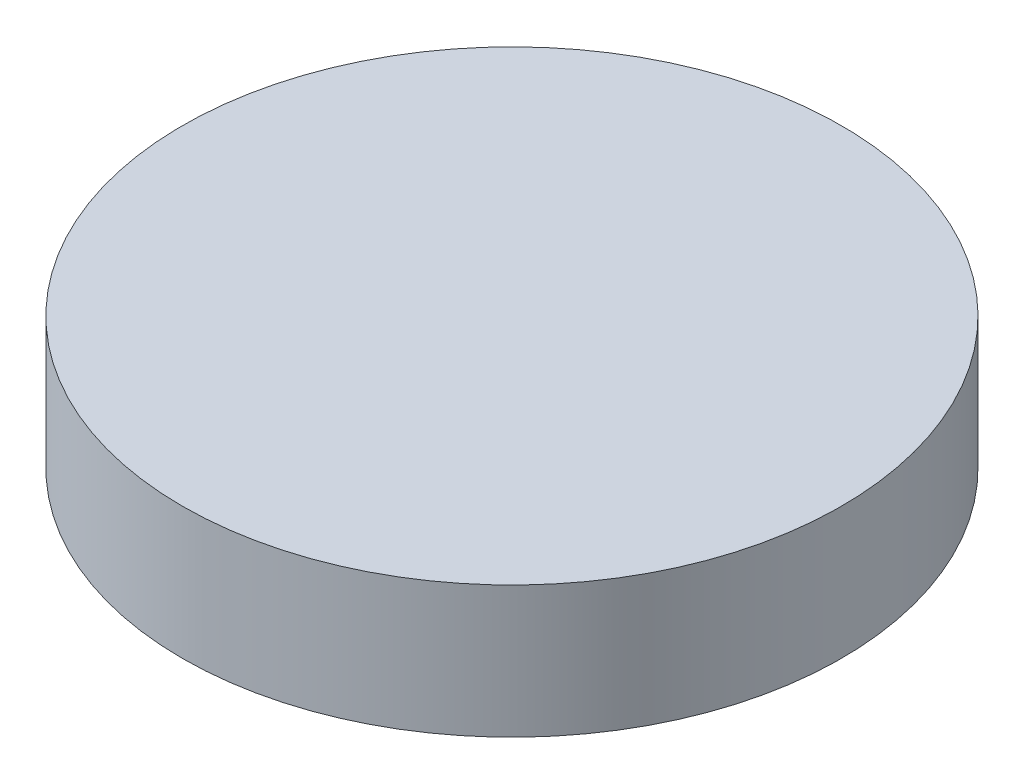
ISO-10303-21;
HEADER;
FILE_DESCRIPTION(('STEP AP214'),'2;1');
FILE_NAME('part.step','',(''),(''),'','','');
FILE_SCHEMA(('AUTOMOTIVE_DESIGN { 1 0 10303 214 1 1 1 1 }'));
ENDSEC;
DATA;
#1=APPLICATION_CONTEXT('core data for automotive mechanical design processes');
#2=APPLICATION_PROTOCOL_DEFINITION('international standard','automotive_design',2000,#1);
#3=PRODUCT_CONTEXT('',#1,'mechanical');
#4=PRODUCT('Part','Part','',(#3));
#5=PRODUCT_RELATED_PRODUCT_CATEGORY('part','',(#4));
#6=PRODUCT_DEFINITION_FORMATION('','',#4);
#7=PRODUCT_DEFINITION_CONTEXT('part definition',#1,'design');
#8=PRODUCT_DEFINITION('design','',#6,#7);
#9=PRODUCT_DEFINITION_SHAPE('','',#8);
#10=(LENGTH_UNIT() NAMED_UNIT(*) SI_UNIT(.MILLI.,.METRE.));
#11=(NAMED_UNIT(*) PLANE_ANGLE_UNIT() SI_UNIT($,.RADIAN.));
#12=(NAMED_UNIT(*) SI_UNIT($,.STERADIAN.) SOLID_ANGLE_UNIT());
#13=UNCERTAINTY_MEASURE_WITH_UNIT(LENGTH_MEASURE(1.E-05),#10,'distance_accuracy_value','');
#14=(GEOMETRIC_REPRESENTATION_CONTEXT(3) GLOBAL_UNCERTAINTY_ASSIGNED_CONTEXT((#13)) GLOBAL_UNIT_ASSIGNED_CONTEXT((#10,
#11,#12)) REPRESENTATION_CONTEXT('',''));
#15=CARTESIAN_POINT('',(0.,0.,0.));
#16=DIRECTION('',(0.,0.,1.));
#17=DIRECTION('',(1.,0.,0.));
#18=AXIS2_PLACEMENT_3D('',#15,#16,#17);
#19=CARTESIAN_POINT('',(0.,8.,0.));
#20=DIRECTION('',(0.,-1.,0.));
#21=DIRECTION('',(0.,0.,-1.));
#22=AXIS2_PLACEMENT_3D('',#19,#20,#21);
#23=CYLINDRICAL_SURFACE('',#22,20.);
#24=CARTESIAN_POINT('',(0.,8.,0.));
#25=DIRECTION('',(0.,1.,0.));
#26=DIRECTION('',(0.,0.,1.));
#27=AXIS2_PLACEMENT_3D('',#24,#25,#26);
#28=CIRCLE('',#27,20.);
#29=CARTESIAN_POINT('',(0.,8.,20.));
#30=VERTEX_POINT('',#29);
#31=EDGE_CURVE('E10',#30,#30,#28,.T.);
#32=ORIENTED_EDGE('',*,*,#31,.F.);
#33=EDGE_LOOP('',(#32));
#34=FACE_BOUND('',#33,.T.);
#35=CARTESIAN_POINT('',(0.,0.,0.));
#36=DIRECTION('',(0.,1.,0.));
#37=DIRECTION('',(0.,0.,1.));
#38=AXIS2_PLACEMENT_3D('',#35,#36,#37);
#39=CIRCLE('',#38,20.);
#40=CARTESIAN_POINT('',(0.,0.,20.));
#41=VERTEX_POINT('',#40);
#42=EDGE_CURVE('E40',#41,#41,#39,.T.);
#43=ORIENTED_EDGE('',*,*,#42,.T.);
#44=EDGE_LOOP('',(#43));
#45=FACE_BOUND('',#44,.T.);
#46=ADVANCED_FACE('F37',(#34,#45),#23,.T.);
#47=CARTESIAN_POINT('',(0.,8.,0.));
#48=DIRECTION('',(0.,1.,0.));
#49=DIRECTION('',(0.,0.,1.));
#50=AXIS2_PLACEMENT_3D('',#47,#48,#49);
#51=PLANE('',#50);
#52=ORIENTED_EDGE('',*,*,#31,.T.);
#53=EDGE_LOOP('',(#52));
#54=FACE_BOUND('',#53,.T.);
#55=ADVANCED_FACE('F52',(#54),#51,.T.);
#56=CARTESIAN_POINT('',(0.,0.,0.));
#57=DIRECTION('',(0.,1.,0.));
#58=DIRECTION('',(0.,0.,1.));
#59=AXIS2_PLACEMENT_3D('',#56,#57,#58);
#60=PLANE('',#59);
#61=ORIENTED_EDGE('',*,*,#42,.F.);
#62=EDGE_LOOP('',(#61));
#63=FACE_BOUND('',#62,.T.);
#64=ADVANCED_FACE('F50',(#63),#60,.F.);
#65=CLOSED_SHELL('',(#46,#55,#64));
#66=MANIFOLD_SOLID_BREP('B2',#65);
#67=ADVANCED_BREP_SHAPE_REPRESENTATION('',(#18,#66),#14);
#68=SHAPE_DEFINITION_REPRESENTATION(#9,#67);
ENDSEC;
END-ISO-10303-21;
